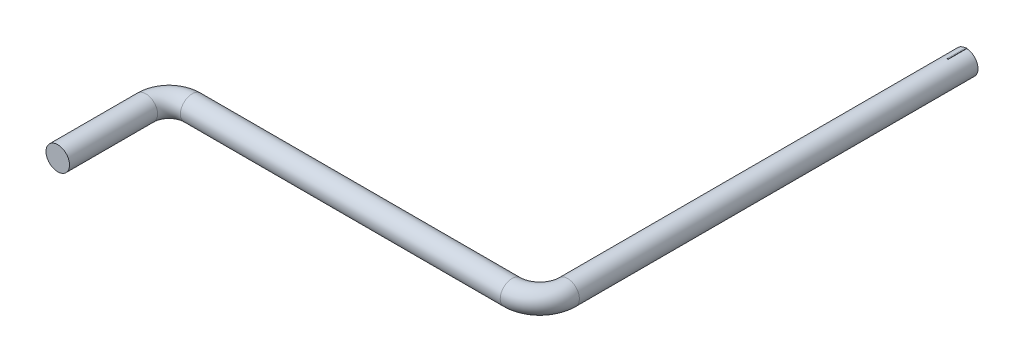
ISO-10303-21;
HEADER;
FILE_DESCRIPTION(('STEP AP214'),'2;1');
FILE_NAME('part.step','',(''),(''),'','','');
FILE_SCHEMA(('AUTOMOTIVE_DESIGN { 1 0 10303 214 1 1 1 1 }'));
ENDSEC;
DATA;
#1=APPLICATION_CONTEXT('core data for automotive mechanical design processes');
#2=APPLICATION_PROTOCOL_DEFINITION('international standard','automotive_design',2000,#1);
#3=PRODUCT_CONTEXT('',#1,'mechanical');
#4=PRODUCT('Part','Part','',(#3));
#5=PRODUCT_RELATED_PRODUCT_CATEGORY('part','',(#4));
#6=PRODUCT_DEFINITION_FORMATION('','',#4);
#7=PRODUCT_DEFINITION_CONTEXT('part definition',#1,'design');
#8=PRODUCT_DEFINITION('design','',#6,#7);
#9=PRODUCT_DEFINITION_SHAPE('','',#8);
#10=(LENGTH_UNIT() NAMED_UNIT(*) SI_UNIT(.MILLI.,.METRE.));
#11=(NAMED_UNIT(*) PLANE_ANGLE_UNIT() SI_UNIT($,.RADIAN.));
#12=(NAMED_UNIT(*) SI_UNIT($,.STERADIAN.) SOLID_ANGLE_UNIT());
#13=UNCERTAINTY_MEASURE_WITH_UNIT(LENGTH_MEASURE(1.E-05),#10,'distance_accuracy_value','');
#14=(GEOMETRIC_REPRESENTATION_CONTEXT(3) GLOBAL_UNCERTAINTY_ASSIGNED_CONTEXT((#13)) GLOBAL_UNIT_ASSIGNED_CONTEXT((#10,
#11,#12)) REPRESENTATION_CONTEXT('',''));
#15=CARTESIAN_POINT('',(0.,0.,0.));
#16=DIRECTION('',(0.,0.,1.));
#17=DIRECTION('',(1.,0.,0.));
#18=AXIS2_PLACEMENT_3D('',#15,#16,#17);
#19=CARTESIAN_POINT('',(0.,0.,10.));
#20=DIRECTION('',(0.,0.,-1.));
#21=DIRECTION('',(-1.,0.,0.));
#22=AXIS2_PLACEMENT_3D('',#19,#20,#21);
#23=CYLINDRICAL_SURFACE('',#22,12.7);
#24=CARTESIAN_POINT('',(0.,0.,20.));
#25=DIRECTION('',(0.,0.,1.));
#26=DIRECTION('',(1.,0.,0.));
#27=AXIS2_PLACEMENT_3D('',#24,#25,#26);
#28=CIRCLE('',#27,12.7);
#29=CARTESIAN_POINT('',(0.555847905285156,12.6878301181167,20.));
#30=VERTEX_POINT('',#29);
#31=CARTESIAN_POINT('',(-0.555847905285156,12.6878301181167,20.));
#32=VERTEX_POINT('',#31);
#33=EDGE_CURVE('E11',#30,#32,#28,.T.);
#34=ORIENTED_EDGE('',*,*,#33,.T.);
#35=DIRECTION('',(0.,0.,-1.));
#36=VECTOR('',#35,1.);
#37=CARTESIAN_POINT('',(-0.555847905285156,12.6878301181167,10.));
#38=LINE('',#37,#36);
#39=CARTESIAN_POINT('',(-0.555847905285156,12.6878301181167,0.));
#40=VERTEX_POINT('',#39);
#41=EDGE_CURVE('E81',#32,#40,#38,.T.);
#42=ORIENTED_EDGE('',*,*,#41,.T.);
#43=CARTESIAN_POINT('',(0.,0.,0.));
#44=DIRECTION('',(0.,0.,1.));
#45=DIRECTION('',(1.,0.,0.));
#46=AXIS2_PLACEMENT_3D('',#43,#44,#45);
#47=CIRCLE('',#46,12.7);
#48=CARTESIAN_POINT('',(0.555847905285156,12.6878301181167,0.));
#49=VERTEX_POINT('',#48);
#50=EDGE_CURVE('E42',#40,#49,#47,.T.);
#51=ORIENTED_EDGE('',*,*,#50,.T.);
#52=DIRECTION('',(0.,0.,-1.));
#53=VECTOR('',#52,1.);
#54=CARTESIAN_POINT('',(0.555847905285156,12.6878301181167,10.));
#55=LINE('',#54,#53);
#56=EDGE_CURVE('E52',#49,#30,#55,.F.);
#57=ORIENTED_EDGE('',*,*,#56,.T.);
#58=EDGE_LOOP('',(#34,#42,#51,#57));
#59=FACE_BOUND('',#58,.T.);
#60=CARTESIAN_POINT('',(0.,0.,430.));
#61=DIRECTION('',(0.,0.,1.));
#62=DIRECTION('',(1.,0.,0.));
#63=AXIS2_PLACEMENT_3D('',#60,#61,#62);
#64=CIRCLE('',#63,12.7);
#65=CARTESIAN_POINT('',(12.7,0.,430.));
#66=VERTEX_POINT('',#65);
#67=EDGE_CURVE('E109',#66,#66,#64,.T.);
#68=ORIENTED_EDGE('',*,*,#67,.F.);
#69=EDGE_LOOP('',(#68));
#70=FACE_BOUND('',#69,.T.);
#71=ADVANCED_FACE('F35',(#59,#70),#23,.T.);
#72=CARTESIAN_POINT('',(0.,0.,0.));
#73=DIRECTION('',(0.,0.,1.));
#74=DIRECTION('',(1.,0.,0.));
#75=AXIS2_PLACEMENT_3D('',#72,#73,#74);
#76=PLANE('',#75);
#77=ORIENTED_EDGE('',*,*,#50,.F.);
#78=DIRECTION('',(0.,1.,0.));
#79=VECTOR('',#78,1.);
#80=CARTESIAN_POINT('',(-0.555847905285156,12.3690803946415,0.));
#81=LINE('',#80,#79);
#82=CARTESIAN_POINT('',(-0.555847905285156,13.0309196053585,0.));
#83=VERTEX_POINT('',#82);
#84=EDGE_CURVE('E101',#40,#83,#81,.T.);
#85=ORIENTED_EDGE('',*,*,#84,.T.);
#86=DIRECTION('',(1.,0.,0.));
#87=VECTOR('',#86,1.);
#88=CARTESIAN_POINT('',(0.555847905285156,13.0309196053585,0.));
#89=LINE('',#88,#87);
#90=CARTESIAN_POINT('',(0.555847905285156,13.0309196053585,0.));
#91=VERTEX_POINT('',#90);
#92=EDGE_CURVE('E91',#83,#91,#89,.T.);
#93=ORIENTED_EDGE('',*,*,#92,.T.);
#94=DIRECTION('',(0.,-1.,0.));
#95=VECTOR('',#94,1.);
#96=CARTESIAN_POINT('',(0.555847905285156,12.3690803946415,0.));
#97=LINE('',#96,#95);
#98=EDGE_CURVE('E85',#91,#49,#97,.T.);
#99=ORIENTED_EDGE('',*,*,#98,.T.);
#100=EDGE_LOOP('',(#77,#85,#93,#99));
#101=FACE_BOUND('',#100,.T.);
#102=ADVANCED_FACE('F127',(#101),#76,.F.);
#103=CARTESIAN_POINT('',(-400.,0.,580.));
#104=DIRECTION('',(0.,0.,1.));
#105=DIRECTION('',(1.,0.,0.));
#106=AXIS2_PLACEMENT_3D('',#103,#104,#105);
#107=PLANE('',#106);
#108=CARTESIAN_POINT('',(-400.,0.,580.));
#109=DIRECTION('',(0.,0.,1.));
#110=DIRECTION('',(1.,0.,0.));
#111=AXIS2_PLACEMENT_3D('',#108,#109,#110);
#112=CIRCLE('',#111,12.7);
#113=CARTESIAN_POINT('',(-387.3,0.,580.));
#114=VERTEX_POINT('',#113);
#115=EDGE_CURVE('E121',#114,#114,#112,.T.);
#116=ORIENTED_EDGE('',*,*,#115,.T.);
#117=EDGE_LOOP('',(#116));
#118=FACE_BOUND('',#117,.T.);
#119=ADVANCED_FACE('F129',(#118),#107,.T.);
#120=CARTESIAN_POINT('',(-30.,0.,430.));
#121=DIRECTION('',(0.,-1.,0.));
#122=DIRECTION('',(0.,0.,-1.));
#123=AXIS2_PLACEMENT_3D('',#120,#121,#122);
#124=TOROIDAL_SURFACE('',#123,30.,12.7);
#125=CARTESIAN_POINT('',(-30.,0.,460.));
#126=DIRECTION('',(-1.,0.,0.));
#127=DIRECTION('',(0.,0.,1.));
#128=AXIS2_PLACEMENT_3D('',#125,#126,#127);
#129=CIRCLE('',#128,12.7);
#130=CARTESIAN_POINT('',(-30.,0.,472.7));
#131=VERTEX_POINT('',#130);
#132=EDGE_CURVE('E112',#131,#131,#129,.T.);
#133=CARTESIAN_POINT('',(-30.,0.,430.));
#134=DIRECTION('',(0.,-1.,0.));
#135=DIRECTION('',(0.,0.,-1.));
#136=AXIS2_PLACEMENT_3D('',#133,#134,#135);
#137=CIRCLE('',#136,42.7);
#138=EDGE_CURVE('',#66,#131,#137,.T.);
#139=ORIENTED_EDGE('',*,*,#67,.T.);
#140=ORIENTED_EDGE('',*,*,#132,.F.);
#141=ORIENTED_EDGE('',*,*,#138,.T.);
#142=ORIENTED_EDGE('',*,*,#138,.F.);
#143=EDGE_LOOP('',(#139,#141,#140,#142));
#144=FACE_BOUND('',#143,.T.);
#145=ADVANCED_FACE('F135',(#144),#124,.T.);
#146=CARTESIAN_POINT('',(-30.,0.,460.));
#147=DIRECTION('',(-1.,0.,0.));
#148=DIRECTION('',(0.,0.,1.));
#149=AXIS2_PLACEMENT_3D('',#146,#147,#148);
#150=CYLINDRICAL_SURFACE('',#149,12.7);
#151=CARTESIAN_POINT('',(-375.,0.,460.));
#152=DIRECTION('',(-1.,0.,0.));
#153=DIRECTION('',(0.,0.,1.));
#154=AXIS2_PLACEMENT_3D('',#151,#152,#153);
#155=CIRCLE('',#154,12.7);
#156=CARTESIAN_POINT('',(-375.,0.,447.3));
#157=VERTEX_POINT('',#156);
#158=EDGE_CURVE('E115',#157,#157,#155,.T.);
#159=ORIENTED_EDGE('',*,*,#158,.F.);
#160=EDGE_LOOP('',(#159));
#161=FACE_BOUND('',#160,.T.);
#162=ORIENTED_EDGE('',*,*,#132,.T.);
#163=EDGE_LOOP('',(#162));
#164=FACE_BOUND('',#163,.T.);
#165=ADVANCED_FACE('F147',(#161,#164),#150,.T.);
#166=CARTESIAN_POINT('',(-375.,0.,485.));
#167=DIRECTION('',(0.,1.,0.));
#168=DIRECTION('',(0.,0.,1.));
#169=AXIS2_PLACEMENT_3D('',#166,#167,#168);
#170=TOROIDAL_SURFACE('',#169,25.,12.7);
#171=CARTESIAN_POINT('',(-400.,0.,485.));
#172=DIRECTION('',(0.,0.,1.));
#173=DIRECTION('',(1.,0.,0.));
#174=AXIS2_PLACEMENT_3D('',#171,#172,#173);
#175=CIRCLE('',#174,12.7);
#176=CARTESIAN_POINT('',(-412.7,0.,485.));
#177=VERTEX_POINT('',#176);
#178=EDGE_CURVE('E118',#177,#177,#175,.T.);
#179=CARTESIAN_POINT('',(-375.,0.,485.));
#180=DIRECTION('',(0.,1.,0.));
#181=DIRECTION('',(0.,0.,1.));
#182=AXIS2_PLACEMENT_3D('',#179,#180,#181);
#183=CIRCLE('',#182,37.7);
#184=EDGE_CURVE('',#157,#177,#183,.T.);
#185=ORIENTED_EDGE('',*,*,#158,.T.);
#186=ORIENTED_EDGE('',*,*,#178,.F.);
#187=ORIENTED_EDGE('',*,*,#184,.T.);
#188=ORIENTED_EDGE('',*,*,#184,.F.);
#189=EDGE_LOOP('',(#185,#187,#186,#188));
#190=FACE_BOUND('',#189,.T.);
#191=ADVANCED_FACE('F139',(#190),#170,.T.);
#192=CARTESIAN_POINT('',(-400.,0.,485.));
#193=DIRECTION('',(0.,0.,1.));
#194=DIRECTION('',(1.,0.,0.));
#195=AXIS2_PLACEMENT_3D('',#192,#193,#194);
#196=CYLINDRICAL_SURFACE('',#195,12.7);
#197=ORIENTED_EDGE('',*,*,#115,.F.);
#198=EDGE_LOOP('',(#197));
#199=FACE_BOUND('',#198,.T.);
#200=ORIENTED_EDGE('',*,*,#178,.T.);
#201=EDGE_LOOP('',(#200));
#202=FACE_BOUND('',#201,.T.);
#203=ADVANCED_FACE('F130',(#199,#202),#196,.T.);
#204=CARTESIAN_POINT('',(-0.555847905285156,12.3690803946415,20.));
#205=DIRECTION('',(-1.,0.,0.));
#206=DIRECTION('',(0.,0.,1.));
#207=AXIS2_PLACEMENT_3D('',#204,#205,#206);
#208=PLANE('',#207);
#209=ORIENTED_EDGE('',*,*,#41,.F.);
#210=DIRECTION('',(0.,1.,0.));
#211=VECTOR('',#210,1.);
#212=CARTESIAN_POINT('',(-0.555847905285156,12.3690803946415,20.));
#213=LINE('',#212,#211);
#214=CARTESIAN_POINT('',(-0.555847905285156,13.0309196053585,20.));
#215=VERTEX_POINT('',#214);
#216=EDGE_CURVE('E75',#32,#215,#213,.T.);
#217=ORIENTED_EDGE('',*,*,#216,.T.);
#218=DIRECTION('',(0.,0.,-1.));
#219=VECTOR('',#218,1.);
#220=CARTESIAN_POINT('',(-0.555847905285156,13.0309196053585,20.));
#221=LINE('',#220,#219);
#222=EDGE_CURVE('E79',#215,#83,#221,.T.);
#223=ORIENTED_EDGE('',*,*,#222,.T.);
#224=ORIENTED_EDGE('',*,*,#84,.F.);
#225=EDGE_LOOP('',(#209,#217,#223,#224));
#226=FACE_BOUND('',#225,.T.);
#227=ADVANCED_FACE('F77',(#226),#208,.T.);
#228=CARTESIAN_POINT('',(0.555847905285156,12.3690803946415,20.));
#229=DIRECTION('',(1.,0.,0.));
#230=DIRECTION('',(0.,0.,-1.));
#231=AXIS2_PLACEMENT_3D('',#228,#229,#230);
#232=PLANE('',#231);
#233=ORIENTED_EDGE('',*,*,#56,.F.);
#234=ORIENTED_EDGE('',*,*,#98,.F.);
#235=DIRECTION('',(0.,0.,-1.));
#236=VECTOR('',#235,1.);
#237=CARTESIAN_POINT('',(0.555847905285156,13.0309196053585,20.));
#238=LINE('',#237,#236);
#239=CARTESIAN_POINT('',(0.555847905285156,13.0309196053585,20.));
#240=VERTEX_POINT('',#239);
#241=EDGE_CURVE('E92',#240,#91,#238,.T.);
#242=ORIENTED_EDGE('',*,*,#241,.F.);
#243=DIRECTION('',(0.,-1.,0.));
#244=VECTOR('',#243,1.);
#245=CARTESIAN_POINT('',(0.555847905285156,12.3690803946415,20.));
#246=LINE('',#245,#244);
#247=EDGE_CURVE('E93',#240,#30,#246,.T.);
#248=ORIENTED_EDGE('',*,*,#247,.T.);
#249=EDGE_LOOP('',(#233,#234,#242,#248));
#250=FACE_BOUND('',#249,.T.);
#251=ADVANCED_FACE('F126',(#250),#232,.T.);
#252=CARTESIAN_POINT('',(0.555847905285156,13.0309196053585,20.));
#253=DIRECTION('',(0.,1.,0.));
#254=DIRECTION('',(0.,0.,1.));
#255=AXIS2_PLACEMENT_3D('',#252,#253,#254);
#256=PLANE('',#255);
#257=ORIENTED_EDGE('',*,*,#92,.F.);
#258=ORIENTED_EDGE('',*,*,#222,.F.);
#259=DIRECTION('',(1.,0.,0.));
#260=VECTOR('',#259,1.);
#261=CARTESIAN_POINT('',(0.555847905285156,13.0309196053585,20.));
#262=LINE('',#261,#260);
#263=EDGE_CURVE('E84',#215,#240,#262,.T.);
#264=ORIENTED_EDGE('',*,*,#263,.T.);
#265=ORIENTED_EDGE('',*,*,#241,.T.);
#266=EDGE_LOOP('',(#257,#258,#264,#265));
#267=FACE_BOUND('',#266,.T.);
#268=ADVANCED_FACE('F89',(#267),#256,.T.);
#269=CARTESIAN_POINT('',(0.,0.,20.));
#270=DIRECTION('',(0.,0.,1.));
#271=DIRECTION('',(1.,0.,0.));
#272=AXIS2_PLACEMENT_3D('',#269,#270,#271);
#273=PLANE('',#272);
#274=ORIENTED_EDGE('',*,*,#33,.F.);
#275=ORIENTED_EDGE('',*,*,#247,.F.);
#276=ORIENTED_EDGE('',*,*,#263,.F.);
#277=ORIENTED_EDGE('',*,*,#216,.F.);
#278=EDGE_LOOP('',(#274,#275,#276,#277));
#279=FACE_BOUND('',#278,.T.);
#280=ADVANCED_FACE('F96',(#279),#273,.T.);
#281=CLOSED_SHELL('',(#71,#102,#119,#145,#165,#191,#203,#227,#251,#268,#280));
#282=MANIFOLD_SOLID_BREP('B2',#281);
#283=ADVANCED_BREP_SHAPE_REPRESENTATION('',(#18,#282),#14);
#284=SHAPE_DEFINITION_REPRESENTATION(#9,#283);
ENDSEC;
END-ISO-10303-21;
